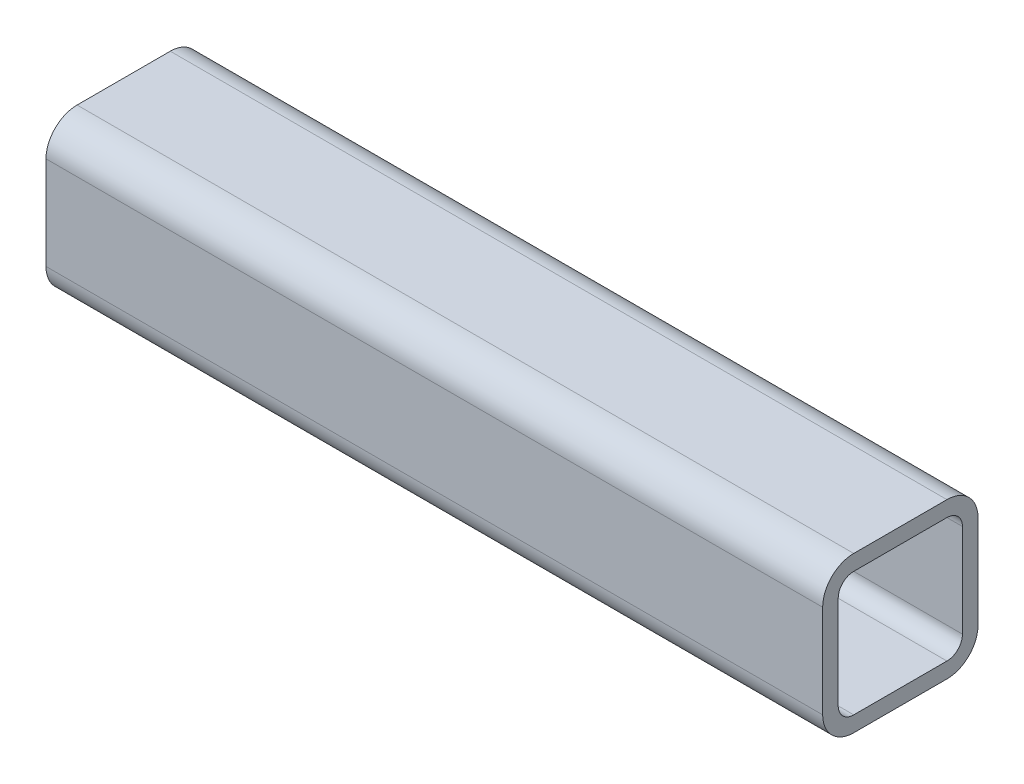
ISO-10303-21;
HEADER;
FILE_DESCRIPTION(('STEP AP214'),'2;1');
FILE_NAME('part.step','',(''),(''),'','','');
FILE_SCHEMA(('AUTOMOTIVE_DESIGN { 1 0 10303 214 1 1 1 1 }'));
ENDSEC;
DATA;
#1=APPLICATION_CONTEXT('core data for automotive mechanical design processes');
#2=APPLICATION_PROTOCOL_DEFINITION('international standard','automotive_design',2000,#1);
#3=PRODUCT_CONTEXT('',#1,'mechanical');
#4=PRODUCT('Part','Part','',(#3));
#5=PRODUCT_RELATED_PRODUCT_CATEGORY('part','',(#4));
#6=PRODUCT_DEFINITION_FORMATION('','',#4);
#7=PRODUCT_DEFINITION_CONTEXT('part definition',#1,'design');
#8=PRODUCT_DEFINITION('design','',#6,#7);
#9=PRODUCT_DEFINITION_SHAPE('','',#8);
#10=(LENGTH_UNIT() NAMED_UNIT(*) SI_UNIT(.MILLI.,.METRE.));
#11=(NAMED_UNIT(*) PLANE_ANGLE_UNIT() SI_UNIT($,.RADIAN.));
#12=(NAMED_UNIT(*) SI_UNIT($,.STERADIAN.) SOLID_ANGLE_UNIT());
#13=UNCERTAINTY_MEASURE_WITH_UNIT(LENGTH_MEASURE(1.E-05),#10,'distance_accuracy_value','');
#14=(GEOMETRIC_REPRESENTATION_CONTEXT(3) GLOBAL_UNCERTAINTY_ASSIGNED_CONTEXT((#13)) GLOBAL_UNIT_ASSIGNED_CONTEXT((#10,
#11,#12)) REPRESENTATION_CONTEXT('',''));
#15=CARTESIAN_POINT('',(0.,0.,0.));
#16=DIRECTION('',(0.,0.,1.));
#17=DIRECTION('',(1.,0.,0.));
#18=AXIS2_PLACEMENT_3D('',#15,#16,#17);
#19=CARTESIAN_POINT('',(50.,-79.9999999999999,-1094.));
#20=DIRECTION('',(1.,0.,0.));
#21=DIRECTION('',(0.,0.,-1.));
#22=AXIS2_PLACEMENT_3D('',#19,#20,#21);
#23=PLANE('',#22);
#24=DIRECTION('',(0.,1.,0.));
#25=VECTOR('',#24,1.);
#26=CARTESIAN_POINT('',(50.,-85.9999999999999,-1095.));
#27=LINE('',#26,#25);
#28=CARTESIAN_POINT('',(50.,-85.9999999999998,-1095.));
#29=VERTEX_POINT('',#28);
#30=CARTESIAN_POINT('',(50.,-73.9999999999998,-1095.));
#31=VERTEX_POINT('',#30);
#32=EDGE_CURVE('E11',#29,#31,#27,.T.);
#33=ORIENTED_EDGE('',*,*,#32,.T.);
#34=CARTESIAN_POINT('',(50.,-73.9999999999999,-1091.));
#35=DIRECTION('',(1.,0.,0.));
#36=DIRECTION('',(0.,0.,-1.));
#37=AXIS2_PLACEMENT_3D('',#34,#35,#36);
#38=CIRCLE('',#37,4.);
#39=CARTESIAN_POINT('',(50.,-69.9999999999999,-1091.));
#40=VERTEX_POINT('',#39);
#41=EDGE_CURVE('E249',#31,#40,#38,.T.);
#42=ORIENTED_EDGE('',*,*,#41,.T.);
#43=DIRECTION('',(0.,0.,1.));
#44=VECTOR('',#43,1.);
#45=CARTESIAN_POINT('',(50.,-69.9999999999999,-1079.));
#46=LINE('',#45,#44);
#47=CARTESIAN_POINT('',(50.,-69.9999999999999,-1079.));
#48=VERTEX_POINT('',#47);
#49=EDGE_CURVE('E246',#40,#48,#46,.T.);
#50=ORIENTED_EDGE('',*,*,#49,.T.);
#51=CARTESIAN_POINT('',(50.,-73.9999999999999,-1079.));
#52=DIRECTION('',(1.,0.,0.));
#53=DIRECTION('',(0.,0.,-1.));
#54=AXIS2_PLACEMENT_3D('',#51,#52,#53);
#55=CIRCLE('',#54,4.);
#56=CARTESIAN_POINT('',(50.,-73.9999999999999,-1075.));
#57=VERTEX_POINT('',#56);
#58=EDGE_CURVE('E243',#48,#57,#55,.T.);
#59=ORIENTED_EDGE('',*,*,#58,.T.);
#60=DIRECTION('',(0.,-1.,0.));
#61=VECTOR('',#60,1.);
#62=CARTESIAN_POINT('',(50.,-73.9999999999999,-1075.));
#63=LINE('',#62,#61);
#64=CARTESIAN_POINT('',(50.,-85.9999999999999,-1075.));
#65=VERTEX_POINT('',#64);
#66=EDGE_CURVE('E240',#57,#65,#63,.T.);
#67=ORIENTED_EDGE('',*,*,#66,.T.);
#68=CARTESIAN_POINT('',(50.,-85.9999999999999,-1079.));
#69=DIRECTION('',(1.,0.,0.));
#70=DIRECTION('',(0.,0.,-1.));
#71=AXIS2_PLACEMENT_3D('',#68,#69,#70);
#72=CIRCLE('',#71,4.);
#73=CARTESIAN_POINT('',(50.,-89.9999999999999,-1079.));
#74=VERTEX_POINT('',#73);
#75=EDGE_CURVE('E237',#65,#74,#72,.T.);
#76=ORIENTED_EDGE('',*,*,#75,.T.);
#77=DIRECTION('',(0.,0.,-1.));
#78=VECTOR('',#77,1.);
#79=CARTESIAN_POINT('',(50.,-89.9999999999999,-1091.));
#80=LINE('',#79,#78);
#81=CARTESIAN_POINT('',(50.,-89.9999999999999,-1091.));
#82=VERTEX_POINT('',#81);
#83=EDGE_CURVE('E234',#74,#82,#80,.T.);
#84=ORIENTED_EDGE('',*,*,#83,.T.);
#85=CARTESIAN_POINT('',(50.,-85.9999999999999,-1091.));
#86=DIRECTION('',(1.,0.,0.));
#87=DIRECTION('',(0.,0.,-1.));
#88=AXIS2_PLACEMENT_3D('',#85,#86,#87);
#89=CIRCLE('',#88,4.);
#90=EDGE_CURVE('E185',#82,#29,#89,.T.);
#91=ORIENTED_EDGE('',*,*,#90,.T.);
#92=EDGE_LOOP('',(#33,#42,#50,#59,#67,#76,#84,#91));
#93=FACE_BOUND('',#92,.T.);
#94=CARTESIAN_POINT('',(50.,-73.9999999999999,-1091.));
#95=DIRECTION('',(1.,0.,0.));
#96=DIRECTION('',(0.,0.,-1.));
#97=AXIS2_PLACEMENT_3D('',#94,#95,#96);
#98=CIRCLE('',#97,2.);
#99=CARTESIAN_POINT('',(50.,-73.9999999999999,-1093.));
#100=VERTEX_POINT('',#99);
#101=CARTESIAN_POINT('',(50.,-71.9999999999999,-1091.));
#102=VERTEX_POINT('',#101);
#103=EDGE_CURVE('E217',#100,#102,#98,.T.);
#104=ORIENTED_EDGE('',*,*,#103,.F.);
#105=DIRECTION('',(0.,1.,0.));
#106=VECTOR('',#105,1.);
#107=CARTESIAN_POINT('',(50.,-85.9999999999999,-1093.));
#108=LINE('',#107,#106);
#109=CARTESIAN_POINT('',(50.,-85.9999999999998,-1093.));
#110=VERTEX_POINT('',#109);
#111=EDGE_CURVE('E173',#110,#100,#108,.T.);
#112=ORIENTED_EDGE('',*,*,#111,.F.);
#113=CARTESIAN_POINT('',(50.,-85.9999999999999,-1091.));
#114=DIRECTION('',(1.,0.,0.));
#115=DIRECTION('',(0.,0.,-1.));
#116=AXIS2_PLACEMENT_3D('',#113,#114,#115);
#117=CIRCLE('',#116,2.);
#118=CARTESIAN_POINT('',(50.,-87.9999999999999,-1091.));
#119=VERTEX_POINT('',#118);
#120=EDGE_CURVE('E70',#119,#110,#117,.T.);
#121=ORIENTED_EDGE('',*,*,#120,.F.);
#122=DIRECTION('',(0.,0.,-1.));
#123=VECTOR('',#122,1.);
#124=CARTESIAN_POINT('',(50.,-87.9999999999999,-1091.));
#125=LINE('',#124,#123);
#126=CARTESIAN_POINT('',(50.,-87.9999999999999,-1079.));
#127=VERTEX_POINT('',#126);
#128=EDGE_CURVE('E82',#127,#119,#125,.T.);
#129=ORIENTED_EDGE('',*,*,#128,.F.);
#130=CARTESIAN_POINT('',(50.,-85.9999999999999,-1079.));
#131=DIRECTION('',(1.,0.,0.));
#132=DIRECTION('',(0.,0.,-1.));
#133=AXIS2_PLACEMENT_3D('',#130,#131,#132);
#134=CIRCLE('',#133,2.);
#135=CARTESIAN_POINT('',(50.,-85.9999999999999,-1077.));
#136=VERTEX_POINT('',#135);
#137=EDGE_CURVE('E222',#136,#127,#134,.T.);
#138=ORIENTED_EDGE('',*,*,#137,.F.);
#139=DIRECTION('',(0.,-1.,0.));
#140=VECTOR('',#139,1.);
#141=CARTESIAN_POINT('',(50.,-73.9999999999999,-1077.));
#142=LINE('',#141,#140);
#143=CARTESIAN_POINT('',(50.,-73.9999999999999,-1077.));
#144=VERTEX_POINT('',#143);
#145=EDGE_CURVE('E212',#144,#136,#142,.T.);
#146=ORIENTED_EDGE('',*,*,#145,.F.);
#147=CARTESIAN_POINT('',(50.,-73.9999999999999,-1079.));
#148=DIRECTION('',(1.,0.,0.));
#149=DIRECTION('',(0.,0.,-1.));
#150=AXIS2_PLACEMENT_3D('',#147,#148,#149);
#151=CIRCLE('',#150,2.);
#152=CARTESIAN_POINT('',(50.,-71.9999999999999,-1079.));
#153=VERTEX_POINT('',#152);
#154=EDGE_CURVE('E209',#153,#144,#151,.T.);
#155=ORIENTED_EDGE('',*,*,#154,.F.);
#156=DIRECTION('',(0.,0.,1.));
#157=VECTOR('',#156,1.);
#158=CARTESIAN_POINT('',(50.,-71.9999999999999,-1079.));
#159=LINE('',#158,#157);
#160=EDGE_CURVE('E204',#102,#153,#159,.T.);
#161=ORIENTED_EDGE('',*,*,#160,.F.);
#162=EDGE_LOOP('',(#104,#112,#121,#129,#138,#146,#155,#161));
#163=FACE_BOUND('',#162,.T.);
#164=ADVANCED_FACE('F41',(#93,#163),#23,.T.);
#165=CARTESIAN_POINT('',(-50.0000000000002,-73.9999999999998,-1085.));
#166=DIRECTION('',(-1.,0.,0.));
#167=DIRECTION('',(0.,0.,1.));
#168=AXIS2_PLACEMENT_3D('',#165,#166,#167);
#169=PLANE('',#168);
#170=CARTESIAN_POINT('',(-50.0000000000002,-73.9999999999999,-1091.));
#171=DIRECTION('',(-1.,0.,0.));
#172=DIRECTION('',(0.,0.,1.));
#173=AXIS2_PLACEMENT_3D('',#170,#171,#172);
#174=CIRCLE('',#173,4.);
#175=CARTESIAN_POINT('',(-50.0000000000002,-69.9999999999999,-1091.));
#176=VERTEX_POINT('',#175);
#177=CARTESIAN_POINT('',(-50.0000000000002,-73.9999999999998,-1095.));
#178=VERTEX_POINT('',#177);
#179=EDGE_CURVE('E190',#176,#178,#174,.T.);
#180=ORIENTED_EDGE('',*,*,#179,.T.);
#181=DIRECTION('',(0.,-1.,0.));
#182=VECTOR('',#181,1.);
#183=CARTESIAN_POINT('',(-50.0000000000002,-85.9999999999999,-1095.));
#184=LINE('',#183,#182);
#185=CARTESIAN_POINT('',(-50.0000000000002,-85.9999999999998,-1095.));
#186=VERTEX_POINT('',#185);
#187=EDGE_CURVE('E182',#178,#186,#184,.T.);
#188=ORIENTED_EDGE('',*,*,#187,.T.);
#189=CARTESIAN_POINT('',(-50.0000000000002,-85.9999999999999,-1091.));
#190=DIRECTION('',(-1.,0.,0.));
#191=DIRECTION('',(0.,0.,1.));
#192=AXIS2_PLACEMENT_3D('',#189,#190,#191);
#193=CIRCLE('',#192,4.);
#194=CARTESIAN_POINT('',(-50.0000000000002,-89.9999999999999,-1091.));
#195=VERTEX_POINT('',#194);
#196=EDGE_CURVE('E192',#186,#195,#193,.T.);
#197=ORIENTED_EDGE('',*,*,#196,.T.);
#198=DIRECTION('',(0.,0.,1.));
#199=VECTOR('',#198,1.);
#200=CARTESIAN_POINT('',(-50.0000000000002,-89.9999999999999,-1091.));
#201=LINE('',#200,#199);
#202=CARTESIAN_POINT('',(-50.0000000000002,-89.9999999999999,-1079.));
#203=VERTEX_POINT('',#202);
#204=EDGE_CURVE('E194',#195,#203,#201,.T.);
#205=ORIENTED_EDGE('',*,*,#204,.T.);
#206=CARTESIAN_POINT('',(-50.0000000000002,-85.9999999999999,-1079.));
#207=DIRECTION('',(-1.,0.,0.));
#208=DIRECTION('',(0.,0.,1.));
#209=AXIS2_PLACEMENT_3D('',#206,#207,#208);
#210=CIRCLE('',#209,4.);
#211=CARTESIAN_POINT('',(-50.0000000000002,-85.9999999999999,-1075.));
#212=VERTEX_POINT('',#211);
#213=EDGE_CURVE('E196',#203,#212,#210,.T.);
#214=ORIENTED_EDGE('',*,*,#213,.T.);
#215=DIRECTION('',(0.,1.,0.));
#216=VECTOR('',#215,1.);
#217=CARTESIAN_POINT('',(-50.0000000000002,-73.9999999999999,-1075.));
#218=LINE('',#217,#216);
#219=CARTESIAN_POINT('',(-50.0000000000002,-73.9999999999999,-1075.));
#220=VERTEX_POINT('',#219);
#221=EDGE_CURVE('E184',#212,#220,#218,.T.);
#222=ORIENTED_EDGE('',*,*,#221,.T.);
#223=CARTESIAN_POINT('',(-50.0000000000002,-73.9999999999999,-1079.));
#224=DIRECTION('',(-1.,0.,0.));
#225=DIRECTION('',(0.,0.,1.));
#226=AXIS2_PLACEMENT_3D('',#223,#224,#225);
#227=CIRCLE('',#226,4.);
#228=CARTESIAN_POINT('',(-50.0000000000002,-69.9999999999999,-1079.));
#229=VERTEX_POINT('',#228);
#230=EDGE_CURVE('E186',#220,#229,#227,.T.);
#231=ORIENTED_EDGE('',*,*,#230,.T.);
#232=DIRECTION('',(0.,0.,-1.));
#233=VECTOR('',#232,1.);
#234=CARTESIAN_POINT('',(-50.0000000000002,-69.9999999999999,-1079.));
#235=LINE('',#234,#233);
#236=EDGE_CURVE('E188',#229,#176,#235,.T.);
#237=ORIENTED_EDGE('',*,*,#236,.T.);
#238=EDGE_LOOP('',(#180,#188,#197,#205,#214,#222,#231,#237));
#239=FACE_BOUND('',#238,.T.);
#240=DIRECTION('',(0.,-1.,0.));
#241=VECTOR('',#240,1.);
#242=CARTESIAN_POINT('',(-50.0000000000002,-85.9999999999999,-1093.));
#243=LINE('',#242,#241);
#244=CARTESIAN_POINT('',(-50.0000000000002,-73.9999999999998,-1093.));
#245=VERTEX_POINT('',#244);
#246=CARTESIAN_POINT('',(-50.0000000000002,-85.9999999999999,-1093.));
#247=VERTEX_POINT('',#246);
#248=EDGE_CURVE('E163',#245,#247,#243,.T.);
#249=ORIENTED_EDGE('',*,*,#248,.F.);
#250=CARTESIAN_POINT('',(-50.0000000000002,-73.9999999999999,-1091.));
#251=DIRECTION('',(-1.,0.,0.));
#252=DIRECTION('',(0.,0.,1.));
#253=AXIS2_PLACEMENT_3D('',#250,#251,#252);
#254=CIRCLE('',#253,2.);
#255=CARTESIAN_POINT('',(-50.0000000000002,-71.9999999999999,-1091.));
#256=VERTEX_POINT('',#255);
#257=EDGE_CURVE('E213',#256,#245,#254,.T.);
#258=ORIENTED_EDGE('',*,*,#257,.F.);
#259=DIRECTION('',(0.,0.,-1.));
#260=VECTOR('',#259,1.);
#261=CARTESIAN_POINT('',(-50.0000000000002,-71.9999999999999,-1079.));
#262=LINE('',#261,#260);
#263=CARTESIAN_POINT('',(-50.0000000000002,-71.9999999999999,-1079.));
#264=VERTEX_POINT('',#263);
#265=EDGE_CURVE('E200',#264,#256,#262,.T.);
#266=ORIENTED_EDGE('',*,*,#265,.F.);
#267=CARTESIAN_POINT('',(-50.0000000000002,-73.9999999999999,-1079.));
#268=DIRECTION('',(-1.,0.,0.));
#269=DIRECTION('',(0.,0.,1.));
#270=AXIS2_PLACEMENT_3D('',#267,#268,#269);
#271=CIRCLE('',#270,2.);
#272=CARTESIAN_POINT('',(-50.0000000000002,-73.9999999999999,-1077.));
#273=VERTEX_POINT('',#272);
#274=EDGE_CURVE('E205',#273,#264,#271,.T.);
#275=ORIENTED_EDGE('',*,*,#274,.F.);
#276=DIRECTION('',(0.,1.,0.));
#277=VECTOR('',#276,1.);
#278=CARTESIAN_POINT('',(-50.0000000000002,-73.9999999999999,-1077.));
#279=LINE('',#278,#277);
#280=CARTESIAN_POINT('',(-50.0000000000002,-85.9999999999999,-1077.));
#281=VERTEX_POINT('',#280);
#282=EDGE_CURVE('E174',#281,#273,#279,.T.);
#283=ORIENTED_EDGE('',*,*,#282,.F.);
#284=CARTESIAN_POINT('',(-50.0000000000002,-85.9999999999999,-1079.));
#285=DIRECTION('',(-1.,0.,0.));
#286=DIRECTION('',(0.,0.,1.));
#287=AXIS2_PLACEMENT_3D('',#284,#285,#286);
#288=CIRCLE('',#287,2.);
#289=CARTESIAN_POINT('',(-50.0000000000002,-87.9999999999999,-1079.));
#290=VERTEX_POINT('',#289);
#291=EDGE_CURVE('E218',#290,#281,#288,.T.);
#292=ORIENTED_EDGE('',*,*,#291,.F.);
#293=DIRECTION('',(0.,0.,1.));
#294=VECTOR('',#293,1.);
#295=CARTESIAN_POINT('',(-50.0000000000002,-87.9999999999999,-1091.));
#296=LINE('',#295,#294);
#297=CARTESIAN_POINT('',(-50.0000000000002,-87.9999999999999,-1091.));
#298=VERTEX_POINT('',#297);
#299=EDGE_CURVE('E166',#298,#290,#296,.T.);
#300=ORIENTED_EDGE('',*,*,#299,.F.);
#301=CARTESIAN_POINT('',(-50.0000000000002,-85.9999999999999,-1091.));
#302=DIRECTION('',(-1.,0.,0.));
#303=DIRECTION('',(0.,0.,1.));
#304=AXIS2_PLACEMENT_3D('',#301,#302,#303);
#305=CIRCLE('',#304,2.);
#306=EDGE_CURVE('E160',#247,#298,#305,.T.);
#307=ORIENTED_EDGE('',*,*,#306,.F.);
#308=EDGE_LOOP('',(#249,#258,#266,#275,#283,#292,#300,#307));
#309=FACE_BOUND('',#308,.T.);
#310=ADVANCED_FACE('F161',(#239,#309),#169,.T.);
#311=CARTESIAN_POINT('',(-59.9999999999999,-85.9999999999999,-1079.));
#312=DIRECTION('',(1.,0.,0.));
#313=DIRECTION('',(0.,0.,-1.));
#314=AXIS2_PLACEMENT_3D('',#311,#312,#313);
#315=CYLINDRICAL_SURFACE('',#314,2.);
#316=DIRECTION('',(1.,0.,0.));
#317=VECTOR('',#316,1.);
#318=CARTESIAN_POINT('',(-59.9999999999999,-85.9999999999999,-1077.));
#319=LINE('',#318,#317);
#320=EDGE_CURVE('E198',#281,#136,#319,.T.);
#321=ORIENTED_EDGE('',*,*,#320,.T.);
#322=ORIENTED_EDGE('',*,*,#137,.T.);
#323=DIRECTION('',(1.,0.,0.));
#324=VECTOR('',#323,1.);
#325=CARTESIAN_POINT('',(-59.9999999999999,-87.9999999999999,-1079.));
#326=LINE('',#325,#324);
#327=EDGE_CURVE('E221',#290,#127,#326,.T.);
#328=ORIENTED_EDGE('',*,*,#327,.F.);
#329=ORIENTED_EDGE('',*,*,#291,.T.);
#330=EDGE_LOOP('',(#321,#322,#328,#329));
#331=FACE_BOUND('',#330,.T.);
#332=ADVANCED_FACE('F299',(#331),#315,.F.);
#333=CARTESIAN_POINT('',(-59.9999999999999,-87.9999999999999,-1091.));
#334=DIRECTION('',(0.,1.,0.));
#335=DIRECTION('',(0.,0.,1.));
#336=AXIS2_PLACEMENT_3D('',#333,#334,#335);
#337=PLANE('',#336);
#338=ORIENTED_EDGE('',*,*,#327,.T.);
#339=ORIENTED_EDGE('',*,*,#128,.T.);
#340=DIRECTION('',(1.,0.,0.));
#341=VECTOR('',#340,1.);
#342=CARTESIAN_POINT('',(-59.9999999999999,-87.9999999999999,-1091.));
#343=LINE('',#342,#341);
#344=EDGE_CURVE('E223',#298,#119,#343,.T.);
#345=ORIENTED_EDGE('',*,*,#344,.F.);
#346=ORIENTED_EDGE('',*,*,#299,.T.);
#347=EDGE_LOOP('',(#338,#339,#345,#346));
#348=FACE_BOUND('',#347,.T.);
#349=ADVANCED_FACE('F300',(#348),#337,.T.);
#350=CARTESIAN_POINT('',(-59.9999999999999,-85.9999999999999,-1091.));
#351=DIRECTION('',(1.,0.,0.));
#352=DIRECTION('',(0.,0.,-1.));
#353=AXIS2_PLACEMENT_3D('',#350,#351,#352);
#354=CYLINDRICAL_SURFACE('',#353,2.);
#355=ORIENTED_EDGE('',*,*,#344,.T.);
#356=ORIENTED_EDGE('',*,*,#120,.T.);
#357=DIRECTION('',(1.,0.,0.));
#358=VECTOR('',#357,1.);
#359=CARTESIAN_POINT('',(-59.9999999999999,-85.9999999999999,-1093.));
#360=LINE('',#359,#358);
#361=EDGE_CURVE('E169',#247,#110,#360,.T.);
#362=ORIENTED_EDGE('',*,*,#361,.F.);
#363=ORIENTED_EDGE('',*,*,#306,.T.);
#364=EDGE_LOOP('',(#355,#356,#362,#363));
#365=FACE_BOUND('',#364,.T.);
#366=ADVANCED_FACE('F170',(#365),#354,.F.);
#367=CARTESIAN_POINT('',(-59.9999999999999,-73.9999999999999,-1091.));
#368=DIRECTION('',(1.,0.,0.));
#369=DIRECTION('',(0.,0.,-1.));
#370=AXIS2_PLACEMENT_3D('',#367,#368,#369);
#371=CYLINDRICAL_SURFACE('',#370,2.);
#372=DIRECTION('',(1.,0.,0.));
#373=VECTOR('',#372,1.);
#374=CARTESIAN_POINT('',(-59.9999999999999,-73.9999999999999,-1093.));
#375=LINE('',#374,#373);
#376=EDGE_CURVE('E44',#245,#100,#375,.T.);
#377=ORIENTED_EDGE('',*,*,#376,.T.);
#378=ORIENTED_EDGE('',*,*,#103,.T.);
#379=DIRECTION('',(1.,0.,0.));
#380=VECTOR('',#379,1.);
#381=CARTESIAN_POINT('',(-59.9999999999999,-71.9999999999999,-1091.));
#382=LINE('',#381,#380);
#383=EDGE_CURVE('E216',#256,#102,#382,.T.);
#384=ORIENTED_EDGE('',*,*,#383,.F.);
#385=ORIENTED_EDGE('',*,*,#257,.T.);
#386=EDGE_LOOP('',(#377,#378,#384,#385));
#387=FACE_BOUND('',#386,.T.);
#388=ADVANCED_FACE('F286',(#387),#371,.F.);
#389=CARTESIAN_POINT('',(-59.9999999999999,-71.9999999999999,-1079.));
#390=DIRECTION('',(0.,-1.,0.));
#391=DIRECTION('',(0.,0.,-1.));
#392=AXIS2_PLACEMENT_3D('',#389,#390,#391);
#393=PLANE('',#392);
#394=ORIENTED_EDGE('',*,*,#383,.T.);
#395=ORIENTED_EDGE('',*,*,#160,.T.);
#396=DIRECTION('',(1.,0.,0.));
#397=VECTOR('',#396,1.);
#398=CARTESIAN_POINT('',(-59.9999999999999,-71.9999999999999,-1079.));
#399=LINE('',#398,#397);
#400=EDGE_CURVE('E203',#264,#153,#399,.T.);
#401=ORIENTED_EDGE('',*,*,#400,.F.);
#402=ORIENTED_EDGE('',*,*,#265,.T.);
#403=EDGE_LOOP('',(#394,#395,#401,#402));
#404=FACE_BOUND('',#403,.T.);
#405=ADVANCED_FACE('F288',(#404),#393,.T.);
#406=CARTESIAN_POINT('',(-59.9999999999999,-73.9999999999999,-1079.));
#407=DIRECTION('',(1.,0.,0.));
#408=DIRECTION('',(0.,0.,-1.));
#409=AXIS2_PLACEMENT_3D('',#406,#407,#408);
#410=CYLINDRICAL_SURFACE('',#409,2.);
#411=ORIENTED_EDGE('',*,*,#400,.T.);
#412=ORIENTED_EDGE('',*,*,#154,.T.);
#413=DIRECTION('',(1.,0.,0.));
#414=VECTOR('',#413,1.);
#415=CARTESIAN_POINT('',(-59.9999999999999,-73.9999999999999,-1077.));
#416=LINE('',#415,#414);
#417=EDGE_CURVE('E208',#273,#144,#416,.T.);
#418=ORIENTED_EDGE('',*,*,#417,.F.);
#419=ORIENTED_EDGE('',*,*,#274,.T.);
#420=EDGE_LOOP('',(#411,#412,#418,#419));
#421=FACE_BOUND('',#420,.T.);
#422=ADVANCED_FACE('F293',(#421),#410,.F.);
#423=CARTESIAN_POINT('',(-59.9999999999999,-73.9999999999999,-1077.));
#424=DIRECTION('',(0.,0.,-1.));
#425=DIRECTION('',(-1.,0.,0.));
#426=AXIS2_PLACEMENT_3D('',#423,#424,#425);
#427=PLANE('',#426);
#428=ORIENTED_EDGE('',*,*,#417,.T.);
#429=ORIENTED_EDGE('',*,*,#145,.T.);
#430=ORIENTED_EDGE('',*,*,#320,.F.);
#431=ORIENTED_EDGE('',*,*,#282,.T.);
#432=EDGE_LOOP('',(#428,#429,#430,#431));
#433=FACE_BOUND('',#432,.T.);
#434=ADVANCED_FACE('F296',(#433),#427,.T.);
#435=CARTESIAN_POINT('',(-59.9999999999999,-85.9999999999999,-1093.));
#436=DIRECTION('',(0.,0.,1.));
#437=DIRECTION('',(1.,0.,0.));
#438=AXIS2_PLACEMENT_3D('',#435,#436,#437);
#439=PLANE('',#438);
#440=ORIENTED_EDGE('',*,*,#361,.T.);
#441=ORIENTED_EDGE('',*,*,#111,.T.);
#442=ORIENTED_EDGE('',*,*,#376,.F.);
#443=ORIENTED_EDGE('',*,*,#248,.T.);
#444=EDGE_LOOP('',(#440,#441,#442,#443));
#445=FACE_BOUND('',#444,.T.);
#446=ADVANCED_FACE('F175',(#445),#439,.T.);
#447=CARTESIAN_POINT('',(-59.9999999999999,-85.9999999999999,-1091.));
#448=DIRECTION('',(1.,0.,0.));
#449=DIRECTION('',(0.,0.,-1.));
#450=AXIS2_PLACEMENT_3D('',#447,#448,#449);
#451=CYLINDRICAL_SURFACE('',#450,4.);
#452=ORIENTED_EDGE('',*,*,#90,.F.);
#453=DIRECTION('',(1.,0.,0.));
#454=VECTOR('',#453,1.);
#455=CARTESIAN_POINT('',(-59.9999999999999,-89.9999999999999,-1091.));
#456=LINE('',#455,#454);
#457=EDGE_CURVE('E178',#195,#82,#456,.T.);
#458=ORIENTED_EDGE('',*,*,#457,.F.);
#459=ORIENTED_EDGE('',*,*,#196,.F.);
#460=DIRECTION('',(1.,0.,0.));
#461=VECTOR('',#460,1.);
#462=CARTESIAN_POINT('',(-59.9999999999999,-85.9999999999999,-1095.));
#463=LINE('',#462,#461);
#464=EDGE_CURVE('E176',#186,#29,#463,.T.);
#465=ORIENTED_EDGE('',*,*,#464,.T.);
#466=EDGE_LOOP('',(#452,#458,#459,#465));
#467=FACE_BOUND('',#466,.T.);
#468=ADVANCED_FACE('F348',(#467),#451,.T.);
#469=CARTESIAN_POINT('',(-59.9999999999999,-89.9999999999999,-1091.));
#470=DIRECTION('',(0.,1.,0.));
#471=DIRECTION('',(0.,0.,1.));
#472=AXIS2_PLACEMENT_3D('',#469,#470,#471);
#473=PLANE('',#472);
#474=ORIENTED_EDGE('',*,*,#83,.F.);
#475=DIRECTION('',(1.,0.,0.));
#476=VECTOR('',#475,1.);
#477=CARTESIAN_POINT('',(-59.9999999999999,-89.9999999999999,-1079.));
#478=LINE('',#477,#476);
#479=EDGE_CURVE('E262',#203,#74,#478,.T.);
#480=ORIENTED_EDGE('',*,*,#479,.F.);
#481=ORIENTED_EDGE('',*,*,#204,.F.);
#482=ORIENTED_EDGE('',*,*,#457,.T.);
#483=EDGE_LOOP('',(#474,#480,#481,#482));
#484=FACE_BOUND('',#483,.T.);
#485=ADVANCED_FACE('F343',(#484),#473,.F.);
#486=CARTESIAN_POINT('',(-59.9999999999999,-85.9999999999999,-1079.));
#487=DIRECTION('',(1.,0.,0.));
#488=DIRECTION('',(0.,0.,-1.));
#489=AXIS2_PLACEMENT_3D('',#486,#487,#488);
#490=CYLINDRICAL_SURFACE('',#489,4.);
#491=ORIENTED_EDGE('',*,*,#75,.F.);
#492=DIRECTION('',(1.,0.,0.));
#493=VECTOR('',#492,1.);
#494=CARTESIAN_POINT('',(-59.9999999999999,-85.9999999999999,-1075.));
#495=LINE('',#494,#493);
#496=EDGE_CURVE('E256',#212,#65,#495,.T.);
#497=ORIENTED_EDGE('',*,*,#496,.F.);
#498=ORIENTED_EDGE('',*,*,#213,.F.);
#499=ORIENTED_EDGE('',*,*,#479,.T.);
#500=EDGE_LOOP('',(#491,#497,#498,#499));
#501=FACE_BOUND('',#500,.T.);
#502=ADVANCED_FACE('F340',(#501),#490,.T.);
#503=CARTESIAN_POINT('',(-59.9999999999999,-73.9999999999999,-1079.));
#504=DIRECTION('',(1.,0.,0.));
#505=DIRECTION('',(0.,0.,-1.));
#506=AXIS2_PLACEMENT_3D('',#503,#504,#505);
#507=CYLINDRICAL_SURFACE('',#506,4.);
#508=ORIENTED_EDGE('',*,*,#58,.F.);
#509=DIRECTION('',(1.,0.,0.));
#510=VECTOR('',#509,1.);
#511=CARTESIAN_POINT('',(-59.9999999999999,-69.9999999999999,-1079.));
#512=LINE('',#511,#510);
#513=EDGE_CURVE('E252',#229,#48,#512,.T.);
#514=ORIENTED_EDGE('',*,*,#513,.F.);
#515=ORIENTED_EDGE('',*,*,#230,.F.);
#516=DIRECTION('',(1.,0.,0.));
#517=VECTOR('',#516,1.);
#518=CARTESIAN_POINT('',(-59.9999999999999,-73.9999999999999,-1075.));
#519=LINE('',#518,#517);
#520=EDGE_CURVE('E265',#220,#57,#519,.T.);
#521=ORIENTED_EDGE('',*,*,#520,.T.);
#522=EDGE_LOOP('',(#508,#514,#515,#521));
#523=FACE_BOUND('',#522,.T.);
#524=ADVANCED_FACE('F331',(#523),#507,.T.);
#525=CARTESIAN_POINT('',(-59.9999999999999,-73.9999999999999,-1075.));
#526=DIRECTION('',(0.,0.,-1.));
#527=DIRECTION('',(-1.,0.,0.));
#528=AXIS2_PLACEMENT_3D('',#525,#526,#527);
#529=PLANE('',#528);
#530=ORIENTED_EDGE('',*,*,#66,.F.);
#531=ORIENTED_EDGE('',*,*,#520,.F.);
#532=ORIENTED_EDGE('',*,*,#221,.F.);
#533=ORIENTED_EDGE('',*,*,#496,.T.);
#534=EDGE_LOOP('',(#530,#531,#532,#533));
#535=FACE_BOUND('',#534,.T.);
#536=ADVANCED_FACE('F336',(#535),#529,.F.);
#537=CARTESIAN_POINT('',(-59.9999999999999,-69.9999999999999,-1079.));
#538=DIRECTION('',(0.,-1.,0.));
#539=DIRECTION('',(0.,0.,-1.));
#540=AXIS2_PLACEMENT_3D('',#537,#538,#539);
#541=PLANE('',#540);
#542=ORIENTED_EDGE('',*,*,#49,.F.);
#543=DIRECTION('',(1.,0.,0.));
#544=VECTOR('',#543,1.);
#545=CARTESIAN_POINT('',(-59.9999999999999,-69.9999999999999,-1091.));
#546=LINE('',#545,#544);
#547=EDGE_CURVE('E255',#176,#40,#546,.T.);
#548=ORIENTED_EDGE('',*,*,#547,.F.);
#549=ORIENTED_EDGE('',*,*,#236,.F.);
#550=ORIENTED_EDGE('',*,*,#513,.T.);
#551=EDGE_LOOP('',(#542,#548,#549,#550));
#552=FACE_BOUND('',#551,.T.);
#553=ADVANCED_FACE('F328',(#552),#541,.F.);
#554=CARTESIAN_POINT('',(-59.9999999999999,-73.9999999999999,-1091.));
#555=DIRECTION('',(1.,0.,0.));
#556=DIRECTION('',(0.,0.,-1.));
#557=AXIS2_PLACEMENT_3D('',#554,#555,#556);
#558=CYLINDRICAL_SURFACE('',#557,4.);
#559=ORIENTED_EDGE('',*,*,#41,.F.);
#560=DIRECTION('',(1.,0.,0.));
#561=VECTOR('',#560,1.);
#562=CARTESIAN_POINT('',(-59.9999999999999,-73.9999999999999,-1095.));
#563=LINE('',#562,#561);
#564=EDGE_CURVE('E50',#178,#31,#563,.T.);
#565=ORIENTED_EDGE('',*,*,#564,.F.);
#566=ORIENTED_EDGE('',*,*,#179,.F.);
#567=ORIENTED_EDGE('',*,*,#547,.T.);
#568=EDGE_LOOP('',(#559,#565,#566,#567));
#569=FACE_BOUND('',#568,.T.);
#570=ADVANCED_FACE('F322',(#569),#558,.T.);
#571=CARTESIAN_POINT('',(-59.9999999999999,-85.9999999999999,-1095.));
#572=DIRECTION('',(0.,0.,1.));
#573=DIRECTION('',(1.,0.,0.));
#574=AXIS2_PLACEMENT_3D('',#571,#572,#573);
#575=PLANE('',#574);
#576=ORIENTED_EDGE('',*,*,#32,.F.);
#577=ORIENTED_EDGE('',*,*,#464,.F.);
#578=ORIENTED_EDGE('',*,*,#187,.F.);
#579=ORIENTED_EDGE('',*,*,#564,.T.);
#580=EDGE_LOOP('',(#576,#577,#578,#579));
#581=FACE_BOUND('',#580,.T.);
#582=ADVANCED_FACE('F349',(#581),#575,.F.);
#583=CLOSED_SHELL('',(#164,#310,#332,#349,#366,#388,#405,#422,#434,#446,#468,#485,#502,#524,
#536,#553,#570,#582));
#584=MANIFOLD_SOLID_BREP('B2',#583);
#585=ADVANCED_BREP_SHAPE_REPRESENTATION('',(#18,#584),#14);
#586=SHAPE_DEFINITION_REPRESENTATION(#9,#585);
ENDSEC;
END-ISO-10303-21;
